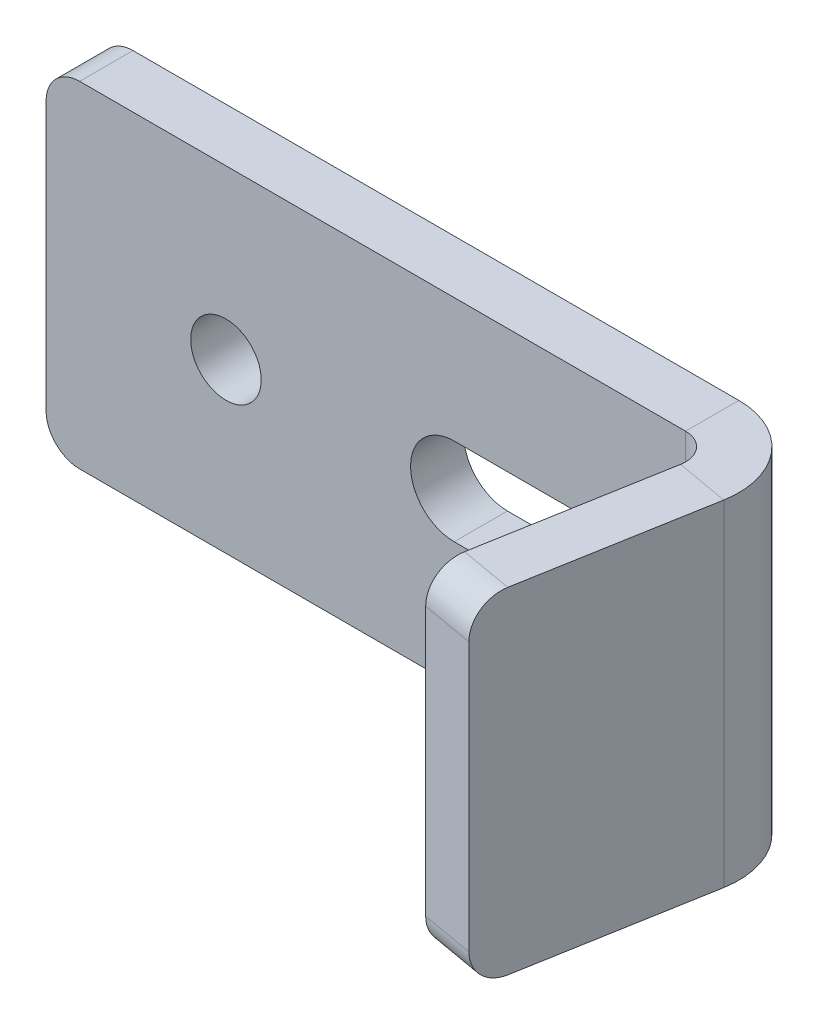
ISO-10303-21;
HEADER;
FILE_DESCRIPTION(('STEP AP214'),'2;1');
FILE_NAME('part.step','',(''),(''),'','','');
FILE_SCHEMA(('AUTOMOTIVE_DESIGN { 1 0 10303 214 1 1 1 1 }'));
ENDSEC;
DATA;
#1=APPLICATION_CONTEXT('core data for automotive mechanical design processes');
#2=APPLICATION_PROTOCOL_DEFINITION('international standard','automotive_design',2000,#1);
#3=PRODUCT_CONTEXT('',#1,'mechanical');
#4=PRODUCT('Part','Part','',(#3));
#5=PRODUCT_RELATED_PRODUCT_CATEGORY('part','',(#4));
#6=PRODUCT_DEFINITION_FORMATION('','',#4);
#7=PRODUCT_DEFINITION_CONTEXT('part definition',#1,'design');
#8=PRODUCT_DEFINITION('design','',#6,#7);
#9=PRODUCT_DEFINITION_SHAPE('','',#8);
#10=(LENGTH_UNIT() NAMED_UNIT(*) SI_UNIT(.MILLI.,.METRE.));
#11=(NAMED_UNIT(*) PLANE_ANGLE_UNIT() SI_UNIT($,.RADIAN.));
#12=(NAMED_UNIT(*) SI_UNIT($,.STERADIAN.) SOLID_ANGLE_UNIT());
#13=UNCERTAINTY_MEASURE_WITH_UNIT(LENGTH_MEASURE(1.E-05),#10,'distance_accuracy_value','');
#14=(GEOMETRIC_REPRESENTATION_CONTEXT(3) GLOBAL_UNCERTAINTY_ASSIGNED_CONTEXT((#13)) GLOBAL_UNIT_ASSIGNED_CONTEXT((#10,
#11,#12)) REPRESENTATION_CONTEXT('',''));
#15=CARTESIAN_POINT('',(0.,0.,0.));
#16=DIRECTION('',(0.,0.,1.));
#17=DIRECTION('',(1.,0.,0.));
#18=AXIS2_PLACEMENT_3D('',#15,#16,#17);
#19=CARTESIAN_POINT('',(46.8943390715026,18.,-35.9706271497751));
#20=DIRECTION('',(0.984807753012208,0.,0.17364817766693));
#21=DIRECTION('',(0.17364817766693,0.,-0.984807753012208));
#22=AXIS2_PLACEMENT_3D('',#19,#20,#21);
#23=PLANE('',#22);
#24=DIRECTION('',(-0.17364817766693,0.,0.984807753012208));
#25=VECTOR('',#24,1.);
#26=CARTESIAN_POINT('',(46.8943390715026,20.,-35.9706271497751));
#27=LINE('',#26,#25);
#28=CARTESIAN_POINT('',(39.663382307907,19.9999999999999,5.03816648204643));
#29=VERTEX_POINT('',#28);
#30=CARTESIAN_POINT('',(37.7344825185734,19.9999999999999,15.9775007891589));
#31=VERTEX_POINT('',#30);
#32=EDGE_CURVE('E44',#29,#31,#27,.T.);
#33=ORIENTED_EDGE('',*,*,#32,.F.);
#34=DIRECTION('',(0.,-1.,0.));
#35=VECTOR('',#34,1.);
#36=CARTESIAN_POINT('',(39.663382307907,18.,5.03816648204643));
#37=LINE('',#36,#35);
#38=CARTESIAN_POINT('',(39.663382307907,0.,5.03816648204643));
#39=VERTEX_POINT('',#38);
#40=EDGE_CURVE('E179',#29,#39,#37,.T.);
#41=ORIENTED_EDGE('',*,*,#40,.T.);
#42=DIRECTION('',(0.17364817766693,0.,-0.984807753012208));
#43=VECTOR('',#42,1.);
#44=CARTESIAN_POINT('',(37.7344825185734,0.,15.9775007891588));
#45=LINE('',#44,#43);
#46=CARTESIAN_POINT('',(37.7344825185734,-1.07119174641568E-13,15.9775007891588));
#47=VERTEX_POINT('',#46);
#48=EDGE_CURVE('E244',#47,#39,#45,.T.);
#49=ORIENTED_EDGE('',*,*,#48,.F.);
#50=CARTESIAN_POINT('',(37.7344825185734,1.99999999999991,15.9775007891588));
#51=DIRECTION('',(0.984807753012208,0.,0.17364817766693));
#52=DIRECTION('',(0.17364817766693,0.,-0.984807753012208));
#53=AXIS2_PLACEMENT_3D('',#50,#51,#52);
#54=CIRCLE('',#53,2.00000000000002);
#55=CARTESIAN_POINT('',(37.3871861632395,1.9999999999999,17.9471162951833));
#56=VERTEX_POINT('',#55);
#57=EDGE_CURVE('E241',#56,#47,#54,.T.);
#58=ORIENTED_EDGE('',*,*,#57,.F.);
#59=DIRECTION('',(0.,-1.,0.));
#60=VECTOR('',#59,1.);
#61=CARTESIAN_POINT('',(37.3871861632395,17.9999999999999,17.9471162951833));
#62=LINE('',#61,#60);
#63=CARTESIAN_POINT('',(37.3871861632395,17.9999999999999,17.9471162951833));
#64=VERTEX_POINT('',#63);
#65=EDGE_CURVE('E238',#64,#56,#62,.T.);
#66=ORIENTED_EDGE('',*,*,#65,.F.);
#67=CARTESIAN_POINT('',(37.7344825185734,17.9999999999999,15.9775007891589));
#68=DIRECTION('',(0.984807753012208,0.,0.17364817766693));
#69=DIRECTION('',(0.17364817766693,0.,-0.984807753012208));
#70=AXIS2_PLACEMENT_3D('',#67,#68,#69);
#71=CIRCLE('',#70,2.00000000000001);
#72=EDGE_CURVE('E235',#31,#64,#71,.T.);
#73=ORIENTED_EDGE('',*,*,#72,.F.);
#74=EDGE_LOOP('',(#33,#41,#49,#58,#66,#73));
#75=FACE_BOUND('',#74,.T.);
#76=ADVANCED_FACE('F40',(#75),#23,.F.);
#77=CARTESIAN_POINT('',(37.7344825185734,0.,15.9775007891588));
#78=DIRECTION('',(0.,-1.,0.));
#79=DIRECTION('',(-0.17364817766693,0.,0.984807753012208));
#80=AXIS2_PLACEMENT_3D('',#77,#78,#79);
#81=PLANE('',#80);
#82=DIRECTION('',(-0.984807753012208,0.,-0.17364817766693));
#83=VECTOR('',#82,1.);
#84=CARTESIAN_POINT('',(39.663382307907,0.,5.03816648204643));
#85=LINE('',#84,#83);
#86=CARTESIAN_POINT('',(42.7901469237208,0.,5.58949944613893));
#87=VERTEX_POINT('',#86);
#88=EDGE_CURVE('E12',#87,#39,#85,.T.);
#89=ORIENTED_EDGE('',*,*,#88,.F.);
#90=DIRECTION('',(0.17364817766693,0.,-0.984807753012208));
#91=VECTOR('',#90,1.);
#92=CARTESIAN_POINT('',(40.8612471343871,0.,16.5288337532513));
#93=LINE('',#92,#91);
#94=CARTESIAN_POINT('',(40.8612471343871,-1.07119174641568E-13,16.5288337532513));
#95=VERTEX_POINT('',#94);
#96=EDGE_CURVE('E57',#95,#87,#93,.T.);
#97=ORIENTED_EDGE('',*,*,#96,.F.);
#98=DIRECTION('',(0.984807753012208,0.,0.17364817766693));
#99=VECTOR('',#98,1.);
#100=CARTESIAN_POINT('',(37.7344825185734,-1.07119174641568E-13,15.9775007891588));
#101=LINE('',#100,#99);
#102=EDGE_CURVE('E253',#47,#95,#101,.T.);
#103=ORIENTED_EDGE('',*,*,#102,.F.);
#104=ORIENTED_EDGE('',*,*,#48,.T.);
#105=EDGE_LOOP('',(#89,#97,#103,#104));
#106=FACE_BOUND('',#105,.T.);
#107=ADVANCED_FACE('F42',(#106),#81,.T.);
#108=CARTESIAN_POINT('',(37.7344825185734,1.99999999999991,15.9775007891588));
#109=DIRECTION('',(0.984807753012208,0.,0.17364817766693));
#110=DIRECTION('',(0.17364817766693,0.,-0.984807753012208));
#111=AXIS2_PLACEMENT_3D('',#108,#109,#110);
#112=CYLINDRICAL_SURFACE('',#111,2.00000000000002);
#113=CARTESIAN_POINT('',(40.8612471343871,1.99999999999991,16.5288337532513));
#114=DIRECTION('',(0.984807753012208,0.,0.17364817766693));
#115=DIRECTION('',(0.17364817766693,0.,-0.984807753012208));
#116=AXIS2_PLACEMENT_3D('',#113,#114,#115);
#117=CIRCLE('',#116,2.00000000000002);
#118=CARTESIAN_POINT('',(40.5139507790533,1.9999999999999,18.4984492592758));
#119=VERTEX_POINT('',#118);
#120=EDGE_CURVE('E251',#119,#95,#117,.T.);
#121=ORIENTED_EDGE('',*,*,#120,.F.);
#122=DIRECTION('',(0.984807753012208,0.,0.17364817766693));
#123=VECTOR('',#122,1.);
#124=CARTESIAN_POINT('',(37.3871861632395,1.9999999999999,17.9471162951833));
#125=LINE('',#124,#123);
#126=EDGE_CURVE('E255',#56,#119,#125,.T.);
#127=ORIENTED_EDGE('',*,*,#126,.F.);
#128=ORIENTED_EDGE('',*,*,#57,.T.);
#129=ORIENTED_EDGE('',*,*,#102,.T.);
#130=EDGE_LOOP('',(#121,#127,#128,#129));
#131=FACE_BOUND('',#130,.T.);
#132=ADVANCED_FACE('F374',(#131),#112,.T.);
#133=CARTESIAN_POINT('',(37.3871861632395,17.9999999999999,17.9471162951833));
#134=DIRECTION('',(-0.17364817766693,0.,0.984807753012208));
#135=DIRECTION('',(0.,1.,0.));
#136=AXIS2_PLACEMENT_3D('',#133,#134,#135);
#137=PLANE('',#136);
#138=DIRECTION('',(0.,-1.,0.));
#139=VECTOR('',#138,1.);
#140=CARTESIAN_POINT('',(40.5139507790533,17.9999999999999,18.4984492592759));
#141=LINE('',#140,#139);
#142=CARTESIAN_POINT('',(40.5139507790533,17.9999999999999,18.4984492592758));
#143=VERTEX_POINT('',#142);
#144=EDGE_CURVE('E248',#143,#119,#141,.T.);
#145=ORIENTED_EDGE('',*,*,#144,.F.);
#146=DIRECTION('',(0.984807753012208,0.,0.17364817766693));
#147=VECTOR('',#146,1.);
#148=CARTESIAN_POINT('',(37.3871861632395,17.9999999999999,17.9471162951833));
#149=LINE('',#148,#147);
#150=EDGE_CURVE('E257',#64,#143,#149,.T.);
#151=ORIENTED_EDGE('',*,*,#150,.F.);
#152=ORIENTED_EDGE('',*,*,#65,.T.);
#153=ORIENTED_EDGE('',*,*,#126,.T.);
#154=EDGE_LOOP('',(#145,#151,#152,#153));
#155=FACE_BOUND('',#154,.T.);
#156=ADVANCED_FACE('F371',(#155),#137,.T.);
#157=CARTESIAN_POINT('',(37.7344825185734,17.9999999999999,15.9775007891589));
#158=DIRECTION('',(0.984807753012208,0.,0.17364817766693));
#159=DIRECTION('',(0.17364817766693,0.,-0.984807753012208));
#160=AXIS2_PLACEMENT_3D('',#157,#158,#159);
#161=CYLINDRICAL_SURFACE('',#160,2.00000000000001);
#162=CARTESIAN_POINT('',(40.8612471343871,17.9999999999999,16.5288337532514));
#163=DIRECTION('',(0.984807753012208,0.,0.17364817766693));
#164=DIRECTION('',(0.17364817766693,0.,-0.984807753012208));
#165=AXIS2_PLACEMENT_3D('',#162,#163,#164);
#166=CIRCLE('',#165,2.00000000000001);
#167=CARTESIAN_POINT('',(40.8612471343871,19.9999999999999,16.5288337532514));
#168=VERTEX_POINT('',#167);
#169=EDGE_CURVE('E245',#168,#143,#166,.T.);
#170=ORIENTED_EDGE('',*,*,#169,.F.);
#171=DIRECTION('',(0.984807753012208,0.,0.17364817766693));
#172=VECTOR('',#171,1.);
#173=CARTESIAN_POINT('',(37.7344825185734,19.9999999999999,15.9775007891589));
#174=LINE('',#173,#172);
#175=EDGE_CURVE('E259',#31,#168,#174,.T.);
#176=ORIENTED_EDGE('',*,*,#175,.F.);
#177=ORIENTED_EDGE('',*,*,#72,.T.);
#178=ORIENTED_EDGE('',*,*,#150,.T.);
#179=EDGE_LOOP('',(#170,#176,#177,#178));
#180=FACE_BOUND('',#179,.T.);
#181=ADVANCED_FACE('F365',(#180),#161,.T.);
#182=CARTESIAN_POINT('',(46.8943390715026,20.,-35.9706271497751));
#183=DIRECTION('',(0.,1.,0.));
#184=DIRECTION('',(0.17364817766693,0.,-0.984807753012208));
#185=AXIS2_PLACEMENT_3D('',#182,#183,#184);
#186=PLANE('',#185);
#187=DIRECTION('',(0.984807753012208,0.,0.17364817766693));
#188=VECTOR('',#187,1.);
#189=CARTESIAN_POINT('',(39.663382307907,19.9999999999999,5.03816648204643));
#190=LINE('',#189,#188);
#191=CARTESIAN_POINT('',(42.7901469237208,19.9999999999999,5.58949944613893));
#192=VERTEX_POINT('',#191);
#193=EDGE_CURVE('E262',#29,#192,#190,.T.);
#194=ORIENTED_EDGE('',*,*,#193,.F.);
#195=ORIENTED_EDGE('',*,*,#32,.T.);
#196=ORIENTED_EDGE('',*,*,#175,.T.);
#197=DIRECTION('',(-0.17364817766693,0.,0.984807753012208));
#198=VECTOR('',#197,1.);
#199=CARTESIAN_POINT('',(50.0211036873164,20.,-35.4192941856826));
#200=LINE('',#199,#198);
#201=EDGE_CURVE('E65',#192,#168,#200,.T.);
#202=ORIENTED_EDGE('',*,*,#201,.F.);
#203=EDGE_LOOP('',(#194,#195,#196,#202));
#204=FACE_BOUND('',#203,.T.);
#205=ADVANCED_FACE('F359',(#204),#186,.T.);
#206=CARTESIAN_POINT('',(50.0211036873164,18.,-35.4192941856826));
#207=DIRECTION('',(0.984807753012208,0.,0.17364817766693));
#208=DIRECTION('',(0.17364817766693,0.,-0.984807753012208));
#209=AXIS2_PLACEMENT_3D('',#206,#207,#208);
#210=PLANE('',#209);
#211=DIRECTION('',(0.,-1.,0.));
#212=VECTOR('',#211,1.);
#213=CARTESIAN_POINT('',(42.7901469237208,18.,5.58949944613893));
#214=LINE('',#213,#212);
#215=EDGE_CURVE('E49',#192,#87,#214,.T.);
#216=ORIENTED_EDGE('',*,*,#215,.F.);
#217=ORIENTED_EDGE('',*,*,#201,.T.);
#218=ORIENTED_EDGE('',*,*,#169,.T.);
#219=ORIENTED_EDGE('',*,*,#144,.T.);
#220=ORIENTED_EDGE('',*,*,#120,.T.);
#221=ORIENTED_EDGE('',*,*,#96,.T.);
#222=EDGE_LOOP('',(#216,#217,#218,#219,#220,#221));
#223=FACE_BOUND('',#222,.T.);
#224=ADVANCED_FACE('F358',(#223),#210,.T.);
#225=CARTESIAN_POINT('',(24.314737928933,10.,0.));
#226=DIRECTION('',(0.,0.,1.));
#227=DIRECTION('',(1.,0.,0.));
#228=AXIS2_PLACEMENT_3D('',#225,#226,#227);
#229=CYLINDRICAL_SURFACE('',#228,2.6);
#230=CARTESIAN_POINT('',(24.314737928933,10.,3.175));
#231=DIRECTION('',(0.,0.,1.));
#232=DIRECTION('',(1.,0.,0.));
#233=AXIS2_PLACEMENT_3D('',#230,#231,#232);
#234=CIRCLE('',#233,2.6);
#235=CARTESIAN_POINT('',(24.314737928933,12.6,3.175));
#236=VERTEX_POINT('',#235);
#237=CARTESIAN_POINT('',(24.314737928933,7.4,3.175));
#238=VERTEX_POINT('',#237);
#239=EDGE_CURVE('E193',#236,#238,#234,.T.);
#240=ORIENTED_EDGE('',*,*,#239,.T.);
#241=DIRECTION('',(0.,0.,1.));
#242=VECTOR('',#241,1.);
#243=CARTESIAN_POINT('',(24.314737928933,7.4,0.));
#244=LINE('',#243,#242);
#245=CARTESIAN_POINT('',(24.314737928933,7.4,0.));
#246=VERTEX_POINT('',#245);
#247=EDGE_CURVE('E226',#246,#238,#244,.T.);
#248=ORIENTED_EDGE('',*,*,#247,.F.);
#249=CARTESIAN_POINT('',(24.314737928933,10.,0.));
#250=DIRECTION('',(0.,0.,1.));
#251=DIRECTION('',(1.,0.,0.));
#252=AXIS2_PLACEMENT_3D('',#249,#250,#251);
#253=CIRCLE('',#252,2.6);
#254=CARTESIAN_POINT('',(24.314737928933,12.6,0.));
#255=VERTEX_POINT('',#254);
#256=EDGE_CURVE('E300',#255,#246,#253,.T.);
#257=ORIENTED_EDGE('',*,*,#256,.F.);
#258=DIRECTION('',(0.,0.,1.));
#259=VECTOR('',#258,1.);
#260=CARTESIAN_POINT('',(24.314737928933,12.6,0.));
#261=LINE('',#260,#259);
#262=EDGE_CURVE('E231',#255,#236,#261,.T.);
#263=ORIENTED_EDGE('',*,*,#262,.T.);
#264=EDGE_LOOP('',(#240,#248,#257,#263));
#265=FACE_BOUND('',#264,.T.);
#266=ADVANCED_FACE('F339',(#265),#229,.F.);
#267=CARTESIAN_POINT('',(24.314737928933,7.4,0.));
#268=DIRECTION('',(0.,-1.,0.));
#269=DIRECTION('',(0.,0.,-1.));
#270=AXIS2_PLACEMENT_3D('',#267,#268,#269);
#271=PLANE('',#270);
#272=DIRECTION('',(1.,0.,0.));
#273=VECTOR('',#272,1.);
#274=CARTESIAN_POINT('',(24.314737928933,7.4,3.175));
#275=LINE('',#274,#273);
#276=CARTESIAN_POINT('',(31.114737928933,7.4,3.175));
#277=VERTEX_POINT('',#276);
#278=EDGE_CURVE('E228',#238,#277,#275,.T.);
#279=ORIENTED_EDGE('',*,*,#278,.T.);
#280=DIRECTION('',(0.,0.,1.));
#281=VECTOR('',#280,1.);
#282=CARTESIAN_POINT('',(31.114737928933,7.4,0.));
#283=LINE('',#282,#281);
#284=CARTESIAN_POINT('',(31.114737928933,7.4,0.));
#285=VERTEX_POINT('',#284);
#286=EDGE_CURVE('E222',#285,#277,#283,.T.);
#287=ORIENTED_EDGE('',*,*,#286,.F.);
#288=DIRECTION('',(1.,0.,0.));
#289=VECTOR('',#288,1.);
#290=CARTESIAN_POINT('',(24.314737928933,7.4,0.));
#291=LINE('',#290,#289);
#292=EDGE_CURVE('E297',#246,#285,#291,.T.);
#293=ORIENTED_EDGE('',*,*,#292,.F.);
#294=ORIENTED_EDGE('',*,*,#247,.T.);
#295=EDGE_LOOP('',(#279,#287,#293,#294));
#296=FACE_BOUND('',#295,.T.);
#297=ADVANCED_FACE('F337',(#296),#271,.F.);
#298=CARTESIAN_POINT('',(31.114737928933,10.,0.));
#299=DIRECTION('',(0.,0.,1.));
#300=DIRECTION('',(1.,0.,0.));
#301=AXIS2_PLACEMENT_3D('',#298,#299,#300);
#302=CYLINDRICAL_SURFACE('',#301,2.6);
#303=CARTESIAN_POINT('',(31.114737928933,10.,3.175));
#304=DIRECTION('',(0.,0.,1.));
#305=DIRECTION('',(1.,0.,0.));
#306=AXIS2_PLACEMENT_3D('',#303,#304,#305);
#307=CIRCLE('',#306,2.6);
#308=CARTESIAN_POINT('',(31.114737928933,12.6,3.175));
#309=VERTEX_POINT('',#308);
#310=EDGE_CURVE('E224',#277,#309,#307,.T.);
#311=ORIENTED_EDGE('',*,*,#310,.T.);
#312=DIRECTION('',(0.,0.,1.));
#313=VECTOR('',#312,1.);
#314=CARTESIAN_POINT('',(31.114737928933,12.6,0.));
#315=LINE('',#314,#313);
#316=CARTESIAN_POINT('',(31.114737928933,12.6,0.));
#317=VERTEX_POINT('',#316);
#318=EDGE_CURVE('E216',#317,#309,#315,.T.);
#319=ORIENTED_EDGE('',*,*,#318,.F.);
#320=CARTESIAN_POINT('',(31.114737928933,10.,0.));
#321=DIRECTION('',(0.,0.,1.));
#322=DIRECTION('',(1.,0.,0.));
#323=AXIS2_PLACEMENT_3D('',#320,#321,#322);
#324=CIRCLE('',#323,2.6);
#325=EDGE_CURVE('E306',#285,#317,#324,.T.);
#326=ORIENTED_EDGE('',*,*,#325,.F.);
#327=ORIENTED_EDGE('',*,*,#286,.T.);
#328=EDGE_LOOP('',(#311,#319,#326,#327));
#329=FACE_BOUND('',#328,.T.);
#330=ADVANCED_FACE('F334',(#329),#302,.F.);
#331=CARTESIAN_POINT('',(31.114737928933,12.6,0.));
#332=DIRECTION('',(0.,1.,0.));
#333=DIRECTION('',(0.,0.,1.));
#334=AXIS2_PLACEMENT_3D('',#331,#332,#333);
#335=PLANE('',#334);
#336=DIRECTION('',(-1.,0.,0.));
#337=VECTOR('',#336,1.);
#338=CARTESIAN_POINT('',(31.114737928933,12.6,3.175));
#339=LINE('',#338,#337);
#340=EDGE_CURVE('E219',#309,#236,#339,.T.);
#341=ORIENTED_EDGE('',*,*,#340,.T.);
#342=ORIENTED_EDGE('',*,*,#262,.F.);
#343=DIRECTION('',(-1.,0.,0.));
#344=VECTOR('',#343,1.);
#345=CARTESIAN_POINT('',(31.114737928933,12.6,0.));
#346=LINE('',#345,#344);
#347=EDGE_CURVE('E303',#317,#255,#346,.T.);
#348=ORIENTED_EDGE('',*,*,#347,.F.);
#349=ORIENTED_EDGE('',*,*,#318,.T.);
#350=EDGE_LOOP('',(#341,#342,#348,#349));
#351=FACE_BOUND('',#350,.T.);
#352=ADVANCED_FACE('F318',(#351),#335,.F.);
#353=CARTESIAN_POINT('',(10.714737928933,10.,3.175));
#354=DIRECTION('',(0.,0.,1.));
#355=DIRECTION('',(1.,0.,0.));
#356=AXIS2_PLACEMENT_3D('',#353,#354,#355);
#357=CYLINDRICAL_SURFACE('',#356,2.09999999999999);
#358=CARTESIAN_POINT('',(10.714737928933,10.,0.));
#359=DIRECTION('',(0.,0.,1.));
#360=DIRECTION('',(1.,0.,0.));
#361=AXIS2_PLACEMENT_3D('',#358,#359,#360);
#362=CIRCLE('',#361,2.09999999999999);
#363=CARTESIAN_POINT('',(12.814737928933,10.,0.));
#364=VERTEX_POINT('',#363);
#365=EDGE_CURVE('E169',#364,#364,#362,.T.);
#366=ORIENTED_EDGE('',*,*,#365,.F.);
#367=EDGE_LOOP('',(#366));
#368=FACE_BOUND('',#367,.T.);
#369=CARTESIAN_POINT('',(10.714737928933,10.,3.175));
#370=DIRECTION('',(0.,0.,1.));
#371=DIRECTION('',(1.,0.,0.));
#372=AXIS2_PLACEMENT_3D('',#369,#370,#371);
#373=CIRCLE('',#372,2.09999999999999);
#374=CARTESIAN_POINT('',(12.814737928933,10.,3.175));
#375=VERTEX_POINT('',#374);
#376=EDGE_CURVE('E213',#375,#375,#373,.T.);
#377=ORIENTED_EDGE('',*,*,#376,.T.);
#378=EDGE_LOOP('',(#377));
#379=FACE_BOUND('',#378,.T.);
#380=ADVANCED_FACE('F314',(#368,#379),#357,.F.);
#381=CARTESIAN_POINT('',(2.,2.,3.175));
#382=DIRECTION('',(0.,0.,-1.));
#383=DIRECTION('',(-1.,0.,0.));
#384=AXIS2_PLACEMENT_3D('',#381,#382,#383);
#385=CYLINDRICAL_SURFACE('',#384,2.);
#386=CARTESIAN_POINT('',(2.,2.,0.));
#387=DIRECTION('',(0.,0.,-1.));
#388=DIRECTION('',(-1.,0.,0.));
#389=AXIS2_PLACEMENT_3D('',#386,#387,#388);
#390=CIRCLE('',#389,2.);
#391=CARTESIAN_POINT('',(2.,0.,0.));
#392=VERTEX_POINT('',#391);
#393=CARTESIAN_POINT('',(0.,2.,0.));
#394=VERTEX_POINT('',#393);
#395=EDGE_CURVE('E286',#392,#394,#390,.T.);
#396=ORIENTED_EDGE('',*,*,#395,.F.);
#397=DIRECTION('',(0.,0.,-1.));
#398=VECTOR('',#397,1.);
#399=CARTESIAN_POINT('',(2.,0.,3.175));
#400=LINE('',#399,#398);
#401=CARTESIAN_POINT('',(2.,0.,3.175));
#402=VERTEX_POINT('',#401);
#403=EDGE_CURVE('E267',#402,#392,#400,.T.);
#404=ORIENTED_EDGE('',*,*,#403,.F.);
#405=CARTESIAN_POINT('',(2.,2.,3.175));
#406=DIRECTION('',(0.,0.,-1.));
#407=DIRECTION('',(-1.,0.,0.));
#408=AXIS2_PLACEMENT_3D('',#405,#406,#407);
#409=CIRCLE('',#408,2.);
#410=CARTESIAN_POINT('',(0.,2.,3.175));
#411=VERTEX_POINT('',#410);
#412=EDGE_CURVE('E210',#402,#411,#409,.T.);
#413=ORIENTED_EDGE('',*,*,#412,.T.);
#414=DIRECTION('',(0.,0.,-1.));
#415=VECTOR('',#414,1.);
#416=CARTESIAN_POINT('',(0.,2.,3.175));
#417=LINE('',#416,#415);
#418=EDGE_CURVE('E208',#411,#394,#417,.T.);
#419=ORIENTED_EDGE('',*,*,#418,.T.);
#420=EDGE_LOOP('',(#396,#404,#413,#419));
#421=FACE_BOUND('',#420,.T.);
#422=ADVANCED_FACE('F317',(#421),#385,.T.);
#423=CARTESIAN_POINT('',(0.,2.,3.175));
#424=DIRECTION('',(-1.,0.,0.));
#425=DIRECTION('',(0.,-1.,0.));
#426=AXIS2_PLACEMENT_3D('',#423,#424,#425);
#427=PLANE('',#426);
#428=DIRECTION('',(0.,1.,0.));
#429=VECTOR('',#428,1.);
#430=CARTESIAN_POINT('',(0.,2.,0.));
#431=LINE('',#430,#429);
#432=CARTESIAN_POINT('',(0.,18.,0.));
#433=VERTEX_POINT('',#432);
#434=EDGE_CURVE('E283',#394,#433,#431,.T.);
#435=ORIENTED_EDGE('',*,*,#434,.F.);
#436=ORIENTED_EDGE('',*,*,#418,.F.);
#437=DIRECTION('',(0.,1.,0.));
#438=VECTOR('',#437,1.);
#439=CARTESIAN_POINT('',(0.,2.,3.175));
#440=LINE('',#439,#438);
#441=CARTESIAN_POINT('',(0.,18.,3.175));
#442=VERTEX_POINT('',#441);
#443=EDGE_CURVE('E205',#411,#442,#440,.T.);
#444=ORIENTED_EDGE('',*,*,#443,.T.);
#445=DIRECTION('',(0.,0.,-1.));
#446=VECTOR('',#445,1.);
#447=CARTESIAN_POINT('',(0.,18.,3.175));
#448=LINE('',#447,#446);
#449=EDGE_CURVE('E203',#442,#433,#448,.T.);
#450=ORIENTED_EDGE('',*,*,#449,.T.);
#451=EDGE_LOOP('',(#435,#436,#444,#450));
#452=FACE_BOUND('',#451,.T.);
#453=ADVANCED_FACE('F349',(#452),#427,.T.);
#454=CARTESIAN_POINT('',(2.,18.,3.175));
#455=DIRECTION('',(0.,0.,-1.));
#456=DIRECTION('',(-1.,0.,0.));
#457=AXIS2_PLACEMENT_3D('',#454,#455,#456);
#458=CYLINDRICAL_SURFACE('',#457,2.);
#459=CARTESIAN_POINT('',(2.,18.,0.));
#460=DIRECTION('',(0.,0.,-1.));
#461=DIRECTION('',(-1.,0.,0.));
#462=AXIS2_PLACEMENT_3D('',#459,#460,#461);
#463=CIRCLE('',#462,2.);
#464=CARTESIAN_POINT('',(2.,20.,0.));
#465=VERTEX_POINT('',#464);
#466=EDGE_CURVE('E280',#433,#465,#463,.T.);
#467=ORIENTED_EDGE('',*,*,#466,.F.);
#468=ORIENTED_EDGE('',*,*,#449,.F.);
#469=CARTESIAN_POINT('',(2.,18.,3.175));
#470=DIRECTION('',(0.,0.,-1.));
#471=DIRECTION('',(-1.,0.,0.));
#472=AXIS2_PLACEMENT_3D('',#469,#470,#471);
#473=CIRCLE('',#472,2.);
#474=CARTESIAN_POINT('',(2.,20.,3.175));
#475=VERTEX_POINT('',#474);
#476=EDGE_CURVE('E198',#442,#475,#473,.T.);
#477=ORIENTED_EDGE('',*,*,#476,.T.);
#478=DIRECTION('',(0.,0.,-1.));
#479=VECTOR('',#478,1.);
#480=CARTESIAN_POINT('',(2.,20.,3.175));
#481=LINE('',#480,#479);
#482=EDGE_CURVE('E196',#475,#465,#481,.T.);
#483=ORIENTED_EDGE('',*,*,#482,.T.);
#484=EDGE_LOOP('',(#467,#468,#477,#483));
#485=FACE_BOUND('',#484,.T.);
#486=ADVANCED_FACE('F323',(#485),#458,.T.);
#487=CARTESIAN_POINT('',(2.,18.,3.175));
#488=DIRECTION('',(0.,0.,-1.));
#489=DIRECTION('',(-1.,0.,0.));
#490=AXIS2_PLACEMENT_3D('',#487,#488,#489);
#491=PLANE('',#490);
#492=DIRECTION('',(0.,-1.,0.));
#493=VECTOR('',#492,1.);
#494=CARTESIAN_POINT('',(38.1,18.,3.175));
#495=LINE('',#494,#493);
#496=CARTESIAN_POINT('',(38.1,19.9999999999999,3.175));
#497=VERTEX_POINT('',#496);
#498=CARTESIAN_POINT('',(38.1,0.,3.175));
#499=VERTEX_POINT('',#498);
#500=EDGE_CURVE('E176',#497,#499,#495,.T.);
#501=ORIENTED_EDGE('',*,*,#500,.F.);
#502=DIRECTION('',(1.,0.,0.));
#503=VECTOR('',#502,1.);
#504=CARTESIAN_POINT('',(2.,20.,3.175));
#505=LINE('',#504,#503);
#506=EDGE_CURVE('E170',#475,#497,#505,.T.);
#507=ORIENTED_EDGE('',*,*,#506,.F.);
#508=ORIENTED_EDGE('',*,*,#476,.F.);
#509=ORIENTED_EDGE('',*,*,#443,.F.);
#510=ORIENTED_EDGE('',*,*,#412,.F.);
#511=DIRECTION('',(-1.,0.,0.));
#512=VECTOR('',#511,1.);
#513=CARTESIAN_POINT('',(54.7495115468388,0.,3.175));
#514=LINE('',#513,#512);
#515=EDGE_CURVE('E191',#499,#402,#514,.T.);
#516=ORIENTED_EDGE('',*,*,#515,.F.);
#517=EDGE_LOOP('',(#501,#507,#508,#509,#510,#516));
#518=FACE_BOUND('',#517,.T.);
#519=ORIENTED_EDGE('',*,*,#376,.F.);
#520=EDGE_LOOP('',(#519));
#521=FACE_BOUND('',#520,.T.);
#522=ORIENTED_EDGE('',*,*,#340,.F.);
#523=ORIENTED_EDGE('',*,*,#310,.F.);
#524=ORIENTED_EDGE('',*,*,#278,.F.);
#525=ORIENTED_EDGE('',*,*,#239,.F.);
#526=EDGE_LOOP('',(#522,#523,#524,#525));
#527=FACE_BOUND('',#526,.T.);
#528=ADVANCED_FACE('F186',(#518,#521,#527),#491,.F.);
#529=CARTESIAN_POINT('',(2.,20.,3.175));
#530=DIRECTION('',(0.,1.,0.));
#531=DIRECTION('',(-1.,0.,0.));
#532=AXIS2_PLACEMENT_3D('',#529,#530,#531);
#533=PLANE('',#532);
#534=ORIENTED_EDGE('',*,*,#506,.T.);
#535=DIRECTION('',(0.,0.,-1.));
#536=VECTOR('',#535,1.);
#537=CARTESIAN_POINT('',(38.1,19.9999999999999,3.175));
#538=LINE('',#537,#536);
#539=CARTESIAN_POINT('',(38.1,19.9999999999999,0.));
#540=VERTEX_POINT('',#539);
#541=EDGE_CURVE('E157',#497,#540,#538,.T.);
#542=ORIENTED_EDGE('',*,*,#541,.T.);
#543=DIRECTION('',(1.,0.,0.));
#544=VECTOR('',#543,1.);
#545=CARTESIAN_POINT('',(2.,20.,0.));
#546=LINE('',#545,#544);
#547=EDGE_CURVE('E294',#465,#540,#546,.T.);
#548=ORIENTED_EDGE('',*,*,#547,.F.);
#549=ORIENTED_EDGE('',*,*,#482,.F.);
#550=EDGE_LOOP('',(#534,#542,#548,#549));
#551=FACE_BOUND('',#550,.T.);
#552=ADVANCED_FACE('F195',(#551),#533,.T.);
#553=CARTESIAN_POINT('',(2.,18.,0.));
#554=DIRECTION('',(0.,0.,-1.));
#555=DIRECTION('',(-1.,0.,0.));
#556=AXIS2_PLACEMENT_3D('',#553,#554,#555);
#557=PLANE('',#556);
#558=ORIENTED_EDGE('',*,*,#365,.T.);
#559=EDGE_LOOP('',(#558));
#560=FACE_BOUND('',#559,.T.);
#561=ORIENTED_EDGE('',*,*,#325,.T.);
#562=ORIENTED_EDGE('',*,*,#347,.T.);
#563=ORIENTED_EDGE('',*,*,#256,.T.);
#564=ORIENTED_EDGE('',*,*,#292,.T.);
#565=EDGE_LOOP('',(#561,#562,#563,#564));
#566=FACE_BOUND('',#565,.T.);
#567=ORIENTED_EDGE('',*,*,#547,.T.);
#568=DIRECTION('',(0.,-1.,0.));
#569=VECTOR('',#568,1.);
#570=CARTESIAN_POINT('',(38.1,18.,0.));
#571=LINE('',#570,#569);
#572=CARTESIAN_POINT('',(38.1,0.,0.));
#573=VERTEX_POINT('',#572);
#574=EDGE_CURVE('E291',#540,#573,#571,.T.);
#575=ORIENTED_EDGE('',*,*,#574,.T.);
#576=DIRECTION('',(-1.,0.,0.));
#577=VECTOR('',#576,1.);
#578=CARTESIAN_POINT('',(54.7495115468388,0.,0.));
#579=LINE('',#578,#577);
#580=EDGE_CURVE('E289',#573,#392,#579,.T.);
#581=ORIENTED_EDGE('',*,*,#580,.T.);
#582=ORIENTED_EDGE('',*,*,#395,.T.);
#583=ORIENTED_EDGE('',*,*,#434,.T.);
#584=ORIENTED_EDGE('',*,*,#466,.T.);
#585=EDGE_LOOP('',(#567,#575,#581,#582,#583,#584));
#586=FACE_BOUND('',#585,.T.);
#587=ADVANCED_FACE('F311',(#560,#566,#586),#557,.T.);
#588=CARTESIAN_POINT('',(54.7495115468388,0.,3.175));
#589=DIRECTION('',(0.,-1.,0.));
#590=DIRECTION('',(1.,0.,0.));
#591=AXIS2_PLACEMENT_3D('',#588,#589,#590);
#592=PLANE('',#591);
#593=ORIENTED_EDGE('',*,*,#580,.F.);
#594=DIRECTION('',(0.,0.,1.));
#595=VECTOR('',#594,1.);
#596=CARTESIAN_POINT('',(38.1,0.,3.175));
#597=LINE('',#596,#595);
#598=EDGE_CURVE('E274',#573,#499,#597,.T.);
#599=ORIENTED_EDGE('',*,*,#598,.T.);
#600=ORIENTED_EDGE('',*,*,#515,.T.);
#601=ORIENTED_EDGE('',*,*,#403,.T.);
#602=EDGE_LOOP('',(#593,#599,#600,#601));
#603=FACE_BOUND('',#602,.T.);
#604=ADVANCED_FACE('F342',(#603),#592,.T.);
#605=CARTESIAN_POINT('',(38.1,19.9999999999999,4.76250000000015));
#606=DIRECTION('',(0.,-1.,0.));
#607=DIRECTION('',(0.,0.,-1.));
#608=AXIS2_PLACEMENT_3D('',#605,#606,#607);
#609=PLANE('',#608);
#610=ORIENTED_EDGE('',*,*,#193,.T.);
#611=CARTESIAN_POINT('',(38.1,19.9999999999999,4.76250000000015));
#612=DIRECTION('',(0.,1.,0.));
#613=DIRECTION('',(0.,0.,1.));
#614=AXIS2_PLACEMENT_3D('',#611,#612,#613);
#615=CIRCLE('',#614,4.76250000000015);
#616=EDGE_CURVE('E164',#192,#540,#615,.T.);
#617=ORIENTED_EDGE('',*,*,#616,.T.);
#618=ORIENTED_EDGE('',*,*,#541,.F.);
#619=CARTESIAN_POINT('',(38.1,19.9999999999999,4.76250000000015));
#620=DIRECTION('',(0.,1.,0.));
#621=DIRECTION('',(0.,0.,-1.));
#622=AXIS2_PLACEMENT_3D('',#619,#620,#621);
#623=CIRCLE('',#622,1.58750000000015);
#624=EDGE_CURVE('E161',#29,#497,#623,.T.);
#625=ORIENTED_EDGE('',*,*,#624,.F.);
#626=EDGE_LOOP('',(#610,#617,#618,#625));
#627=FACE_BOUND('',#626,.T.);
#628=ADVANCED_FACE('F160',(#627),#609,.F.);
#629=CARTESIAN_POINT('',(38.1,0.,4.76250000000015));
#630=DIRECTION('',(0.,1.,0.));
#631=DIRECTION('',(0.,0.,1.));
#632=AXIS2_PLACEMENT_3D('',#629,#630,#631);
#633=PLANE('',#632);
#634=ORIENTED_EDGE('',*,*,#598,.F.);
#635=CARTESIAN_POINT('',(38.1,0.,4.76250000000015));
#636=DIRECTION('',(0.,1.,0.));
#637=DIRECTION('',(0.,0.,1.));
#638=AXIS2_PLACEMENT_3D('',#635,#636,#637);
#639=CIRCLE('',#638,4.76250000000015);
#640=EDGE_CURVE('E181',#573,#87,#639,.F.);
#641=ORIENTED_EDGE('',*,*,#640,.T.);
#642=ORIENTED_EDGE('',*,*,#88,.T.);
#643=CARTESIAN_POINT('',(38.1,0.,4.76250000000015));
#644=DIRECTION('',(0.,-1.,0.));
#645=DIRECTION('',(0.,0.,1.));
#646=AXIS2_PLACEMENT_3D('',#643,#644,#645);
#647=CIRCLE('',#646,1.58750000000015);
#648=EDGE_CURVE('E180',#499,#39,#647,.T.);
#649=ORIENTED_EDGE('',*,*,#648,.F.);
#650=EDGE_LOOP('',(#634,#641,#642,#649));
#651=FACE_BOUND('',#650,.T.);
#652=ADVANCED_FACE('F354',(#651),#633,.F.);
#653=CARTESIAN_POINT('',(38.1,-10.9949509352458,4.76250000000015));
#654=DIRECTION('',(0.,1.,0.));
#655=DIRECTION('',(0.,0.,1.));
#656=AXIS2_PLACEMENT_3D('',#653,#654,#655);
#657=CYLINDRICAL_SURFACE('',#656,1.58750000000015);
#658=ORIENTED_EDGE('',*,*,#648,.T.);
#659=ORIENTED_EDGE('',*,*,#40,.F.);
#660=ORIENTED_EDGE('',*,*,#624,.T.);
#661=ORIENTED_EDGE('',*,*,#500,.T.);
#662=EDGE_LOOP('',(#658,#659,#660,#661));
#663=FACE_BOUND('',#662,.T.);
#664=ADVANCED_FACE('F175',(#663),#657,.F.);
#665=CARTESIAN_POINT('',(38.1,-10.9949509352458,4.76250000000015));
#666=DIRECTION('',(0.,1.,0.));
#667=DIRECTION('',(0.,0.,1.));
#668=AXIS2_PLACEMENT_3D('',#665,#666,#667);
#669=CYLINDRICAL_SURFACE('',#668,4.76250000000015);
#670=ORIENTED_EDGE('',*,*,#640,.F.);
#671=ORIENTED_EDGE('',*,*,#574,.F.);
#672=ORIENTED_EDGE('',*,*,#616,.F.);
#673=ORIENTED_EDGE('',*,*,#215,.T.);
#674=EDGE_LOOP('',(#670,#671,#672,#673));
#675=FACE_BOUND('',#674,.T.);
#676=ADVANCED_FACE('F356',(#675),#669,.T.);
#677=CLOSED_SHELL('',(#76,#107,#132,#156,#181,#205,#224,#266,#297,#330,#352,#380,#422,#453,#486,
#528,#552,#587,#604,#628,#652,#664,#676));
#678=MANIFOLD_SOLID_BREP('B2',#677);
#679=ADVANCED_BREP_SHAPE_REPRESENTATION('',(#18,#678),#14);
#680=SHAPE_DEFINITION_REPRESENTATION(#9,#679);
ENDSEC;
END-ISO-10303-21;
